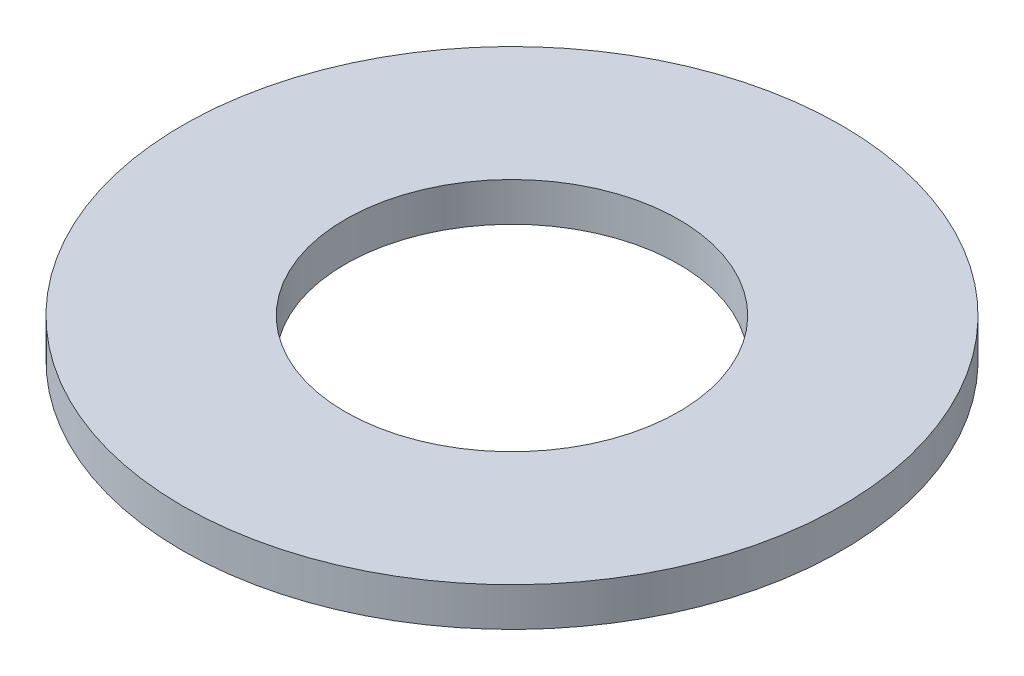
ISO-10303-21;
HEADER;
FILE_DESCRIPTION(('STEP AP214'),'2;1');
FILE_NAME('part.step','',(''),(''),'','','');
FILE_SCHEMA(('AUTOMOTIVE_DESIGN { 1 0 10303 214 1 1 1 1 }'));
ENDSEC;
DATA;
#1=APPLICATION_CONTEXT('core data for automotive mechanical design processes');
#2=APPLICATION_PROTOCOL_DEFINITION('international standard','automotive_design',2000,#1);
#3=PRODUCT_CONTEXT('',#1,'mechanical');
#4=PRODUCT('Part','Part','',(#3));
#5=PRODUCT_RELATED_PRODUCT_CATEGORY('part','',(#4));
#6=PRODUCT_DEFINITION_FORMATION('','',#4);
#7=PRODUCT_DEFINITION_CONTEXT('part definition',#1,'design');
#8=PRODUCT_DEFINITION('design','',#6,#7);
#9=PRODUCT_DEFINITION_SHAPE('','',#8);
#10=(LENGTH_UNIT() NAMED_UNIT(*) SI_UNIT(.MILLI.,.METRE.));
#11=(NAMED_UNIT(*) PLANE_ANGLE_UNIT() SI_UNIT($,.RADIAN.));
#12=(NAMED_UNIT(*) SI_UNIT($,.STERADIAN.) SOLID_ANGLE_UNIT());
#13=UNCERTAINTY_MEASURE_WITH_UNIT(LENGTH_MEASURE(1.E-05),#10,'distance_accuracy_value','');
#14=(GEOMETRIC_REPRESENTATION_CONTEXT(3) GLOBAL_UNCERTAINTY_ASSIGNED_CONTEXT((#13)) GLOBAL_UNIT_ASSIGNED_CONTEXT((#10,
#11,#12)) REPRESENTATION_CONTEXT('',''));
#15=CARTESIAN_POINT('',(0.,0.,0.));
#16=DIRECTION('',(0.,0.,1.));
#17=DIRECTION('',(1.,0.,0.));
#18=AXIS2_PLACEMENT_3D('',#15,#16,#17);
#19=CARTESIAN_POINT('',(0.,0.5,0.));
#20=DIRECTION('',(0.,1.,0.));
#21=DIRECTION('',(0.,0.,1.));
#22=AXIS2_PLACEMENT_3D('',#19,#20,#21);
#23=PLANE('',#22);
#24=CARTESIAN_POINT('',(0.,0.5,0.));
#25=DIRECTION('',(0.,1.,0.));
#26=DIRECTION('',(0.,0.,1.));
#27=AXIS2_PLACEMENT_3D('',#24,#25,#26);
#28=CIRCLE('',#27,4.25);
#29=CARTESIAN_POINT('',(0.,0.5,4.25));
#30=VERTEX_POINT('',#29);
#31=EDGE_CURVE('E10',#30,#30,#28,.T.);
#32=ORIENTED_EDGE('',*,*,#31,.T.);
#33=EDGE_LOOP('',(#32));
#34=FACE_BOUND('',#33,.T.);
#35=CARTESIAN_POINT('',(0.,0.5,0.));
#36=DIRECTION('',(0.,1.,0.));
#37=DIRECTION('',(0.,0.,1.));
#38=AXIS2_PLACEMENT_3D('',#35,#36,#37);
#39=CIRCLE('',#38,2.15);
#40=CARTESIAN_POINT('',(0.,0.5,2.15));
#41=VERTEX_POINT('',#40);
#42=EDGE_CURVE('E44',#41,#41,#39,.T.);
#43=ORIENTED_EDGE('',*,*,#42,.F.);
#44=EDGE_LOOP('',(#43));
#45=FACE_BOUND('',#44,.T.);
#46=ADVANCED_FACE('F33',(#34,#45),#23,.T.);
#47=CARTESIAN_POINT('',(0.,0.,0.));
#48=DIRECTION('',(0.,1.,0.));
#49=DIRECTION('',(0.,0.,1.));
#50=AXIS2_PLACEMENT_3D('',#47,#48,#49);
#51=PLANE('',#50);
#52=CARTESIAN_POINT('',(0.,0.,0.));
#53=DIRECTION('',(0.,1.,0.));
#54=DIRECTION('',(0.,0.,1.));
#55=AXIS2_PLACEMENT_3D('',#52,#53,#54);
#56=CIRCLE('',#55,4.25);
#57=CARTESIAN_POINT('',(0.,0.,4.25));
#58=VERTEX_POINT('',#57);
#59=EDGE_CURVE('E37',#58,#58,#56,.T.);
#60=ORIENTED_EDGE('',*,*,#59,.F.);
#61=EDGE_LOOP('',(#60));
#62=FACE_BOUND('',#61,.T.);
#63=CARTESIAN_POINT('',(0.,0.,0.));
#64=DIRECTION('',(0.,1.,0.));
#65=DIRECTION('',(0.,0.,1.));
#66=AXIS2_PLACEMENT_3D('',#63,#64,#65);
#67=CIRCLE('',#66,2.15);
#68=CARTESIAN_POINT('',(0.,0.,2.15));
#69=VERTEX_POINT('',#68);
#70=EDGE_CURVE('E46',#69,#69,#67,.T.);
#71=ORIENTED_EDGE('',*,*,#70,.T.);
#72=EDGE_LOOP('',(#71));
#73=FACE_BOUND('',#72,.T.);
#74=ADVANCED_FACE('F56',(#62,#73),#51,.F.);
#75=CARTESIAN_POINT('',(0.,0.5,0.));
#76=DIRECTION('',(0.,-1.,0.));
#77=DIRECTION('',(0.,0.,-1.));
#78=AXIS2_PLACEMENT_3D('',#75,#76,#77);
#79=CYLINDRICAL_SURFACE('',#78,4.25);
#80=ORIENTED_EDGE('',*,*,#31,.F.);
#81=EDGE_LOOP('',(#80));
#82=FACE_BOUND('',#81,.T.);
#83=ORIENTED_EDGE('',*,*,#59,.T.);
#84=EDGE_LOOP('',(#83));
#85=FACE_BOUND('',#84,.T.);
#86=ADVANCED_FACE('F35',(#82,#85),#79,.T.);
#87=CARTESIAN_POINT('',(0.,0.5,0.));
#88=DIRECTION('',(0.,-1.,0.));
#89=DIRECTION('',(0.,0.,-1.));
#90=AXIS2_PLACEMENT_3D('',#87,#88,#89);
#91=CYLINDRICAL_SURFACE('',#90,2.15);
#92=ORIENTED_EDGE('',*,*,#42,.T.);
#93=EDGE_LOOP('',(#92));
#94=FACE_BOUND('',#93,.T.);
#95=ORIENTED_EDGE('',*,*,#70,.F.);
#96=EDGE_LOOP('',(#95));
#97=FACE_BOUND('',#96,.T.);
#98=ADVANCED_FACE('F52',(#94,#97),#91,.F.);
#99=CLOSED_SHELL('',(#46,#74,#86,#98));
#100=MANIFOLD_SOLID_BREP('B2',#99);
#101=ADVANCED_BREP_SHAPE_REPRESENTATION('',(#18,#100),#14);
#102=SHAPE_DEFINITION_REPRESENTATION(#9,#101);
ENDSEC;
END-ISO-10303-21;
